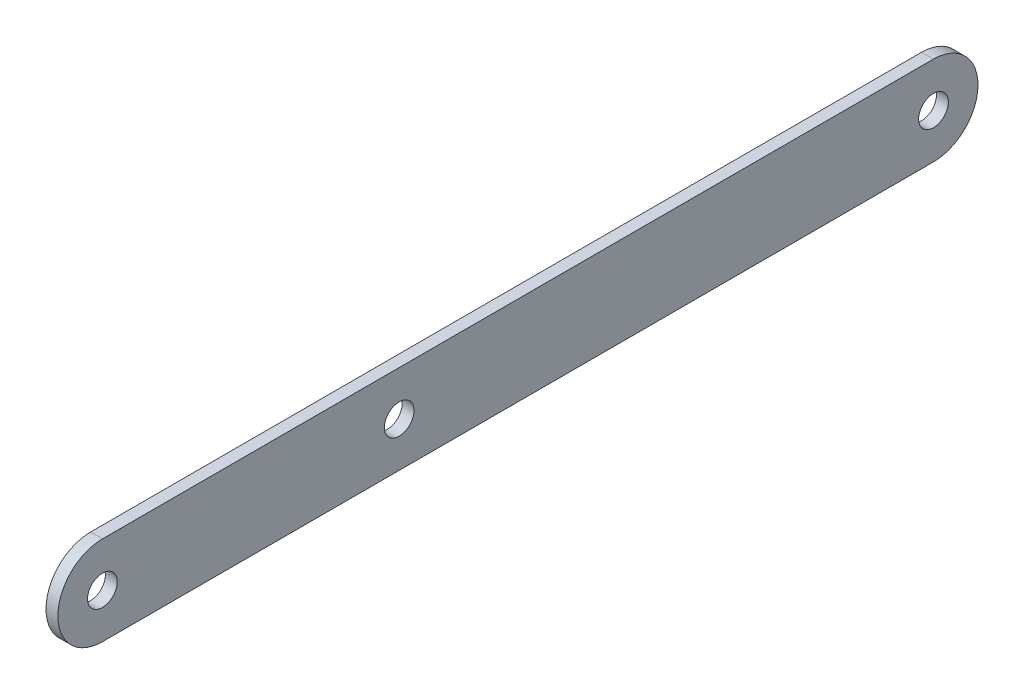
ISO-10303-21;
HEADER;
FILE_DESCRIPTION(('STEP AP214'),'2;1');
FILE_NAME('part.step','',(''),(''),'','','');
FILE_SCHEMA(('AUTOMOTIVE_DESIGN { 1 0 10303 214 1 1 1 1 }'));
ENDSEC;
DATA;
#1=APPLICATION_CONTEXT('core data for automotive mechanical design processes');
#2=APPLICATION_PROTOCOL_DEFINITION('international standard','automotive_design',2000,#1);
#3=PRODUCT_CONTEXT('',#1,'mechanical');
#4=PRODUCT('Part','Part','',(#3));
#5=PRODUCT_RELATED_PRODUCT_CATEGORY('part','',(#4));
#6=PRODUCT_DEFINITION_FORMATION('','',#4);
#7=PRODUCT_DEFINITION_CONTEXT('part definition',#1,'design');
#8=PRODUCT_DEFINITION('design','',#6,#7);
#9=PRODUCT_DEFINITION_SHAPE('','',#8);
#10=(LENGTH_UNIT() NAMED_UNIT(*) SI_UNIT(.MILLI.,.METRE.));
#11=(NAMED_UNIT(*) PLANE_ANGLE_UNIT() SI_UNIT($,.RADIAN.));
#12=(NAMED_UNIT(*) SI_UNIT($,.STERADIAN.) SOLID_ANGLE_UNIT());
#13=UNCERTAINTY_MEASURE_WITH_UNIT(LENGTH_MEASURE(1.E-05),#10,'distance_accuracy_value','');
#14=(GEOMETRIC_REPRESENTATION_CONTEXT(3) GLOBAL_UNCERTAINTY_ASSIGNED_CONTEXT((#13)) GLOBAL_UNIT_ASSIGNED_CONTEXT((#10,
#11,#12)) REPRESENTATION_CONTEXT('',''));
#15=CARTESIAN_POINT('',(0.,0.,0.));
#16=DIRECTION('',(0.,0.,1.));
#17=DIRECTION('',(1.,0.,0.));
#18=AXIS2_PLACEMENT_3D('',#15,#16,#17);
#19=CARTESIAN_POINT('',(-2.,0.,70.));
#20=DIRECTION('',(1.,0.,0.));
#21=DIRECTION('',(0.,0.,-1.));
#22=AXIS2_PLACEMENT_3D('',#19,#20,#21);
#23=CYLINDRICAL_SURFACE('',#22,7.5);
#24=CARTESIAN_POINT('',(0.,0.,70.));
#25=DIRECTION('',(1.,0.,0.));
#26=DIRECTION('',(0.,0.,-1.));
#27=AXIS2_PLACEMENT_3D('',#24,#25,#26);
#28=CIRCLE('',#27,7.5);
#29=CARTESIAN_POINT('',(0.,7.5,70.));
#30=VERTEX_POINT('',#29);
#31=CARTESIAN_POINT('',(0.,-7.5,70.));
#32=VERTEX_POINT('',#31);
#33=EDGE_CURVE('E100',#30,#32,#28,.T.);
#34=ORIENTED_EDGE('',*,*,#33,.F.);
#35=DIRECTION('',(1.,0.,0.));
#36=VECTOR('',#35,1.);
#37=CARTESIAN_POINT('',(-2.,7.5,70.));
#38=LINE('',#37,#36);
#39=CARTESIAN_POINT('',(-2.,7.5,70.));
#40=VERTEX_POINT('',#39);
#41=EDGE_CURVE('E11',#40,#30,#38,.T.);
#42=ORIENTED_EDGE('',*,*,#41,.F.);
#43=CARTESIAN_POINT('',(-2.,0.,70.));
#44=DIRECTION('',(1.,0.,0.));
#45=DIRECTION('',(0.,0.,-1.));
#46=AXIS2_PLACEMENT_3D('',#43,#44,#45);
#47=CIRCLE('',#46,7.5);
#48=CARTESIAN_POINT('',(-2.,-7.5,70.));
#49=VERTEX_POINT('',#48);
#50=EDGE_CURVE('E93',#40,#49,#47,.T.);
#51=ORIENTED_EDGE('',*,*,#50,.T.);
#52=DIRECTION('',(1.,0.,0.));
#53=VECTOR('',#52,1.);
#54=CARTESIAN_POINT('',(-2.,-7.5,70.));
#55=LINE('',#54,#53);
#56=EDGE_CURVE('E38',#49,#32,#55,.T.);
#57=ORIENTED_EDGE('',*,*,#56,.T.);
#58=EDGE_LOOP('',(#34,#42,#51,#57));
#59=FACE_BOUND('',#58,.T.);
#60=ADVANCED_FACE('F35',(#59),#23,.T.);
#61=CARTESIAN_POINT('',(-2.,7.5,-70.));
#62=DIRECTION('',(0.,1.,0.));
#63=DIRECTION('',(0.,0.,1.));
#64=AXIS2_PLACEMENT_3D('',#61,#62,#63);
#65=PLANE('',#64);
#66=DIRECTION('',(0.,0.,1.));
#67=VECTOR('',#66,1.);
#68=CARTESIAN_POINT('',(0.,7.5,-70.));
#69=LINE('',#68,#67);
#70=CARTESIAN_POINT('',(0.,7.5,-70.));
#71=VERTEX_POINT('',#70);
#72=EDGE_CURVE('E95',#71,#30,#69,.T.);
#73=ORIENTED_EDGE('',*,*,#72,.F.);
#74=DIRECTION('',(1.,0.,0.));
#75=VECTOR('',#74,1.);
#76=CARTESIAN_POINT('',(-2.,7.5,-70.));
#77=LINE('',#76,#75);
#78=CARTESIAN_POINT('',(-2.,7.5,-70.));
#79=VERTEX_POINT('',#78);
#80=EDGE_CURVE('E44',#79,#71,#77,.T.);
#81=ORIENTED_EDGE('',*,*,#80,.F.);
#82=DIRECTION('',(0.,0.,1.));
#83=VECTOR('',#82,1.);
#84=CARTESIAN_POINT('',(-2.,7.5,-70.));
#85=LINE('',#84,#83);
#86=EDGE_CURVE('E90',#79,#40,#85,.T.);
#87=ORIENTED_EDGE('',*,*,#86,.T.);
#88=ORIENTED_EDGE('',*,*,#41,.T.);
#89=EDGE_LOOP('',(#73,#81,#87,#88));
#90=FACE_BOUND('',#89,.T.);
#91=ADVANCED_FACE('F111',(#90),#65,.T.);
#92=CARTESIAN_POINT('',(-2.,0.,-70.));
#93=DIRECTION('',(1.,0.,0.));
#94=DIRECTION('',(0.,0.,-1.));
#95=AXIS2_PLACEMENT_3D('',#92,#93,#94);
#96=CYLINDRICAL_SURFACE('',#95,7.5);
#97=CARTESIAN_POINT('',(0.,0.,-70.));
#98=DIRECTION('',(1.,0.,0.));
#99=DIRECTION('',(0.,0.,1.));
#100=AXIS2_PLACEMENT_3D('',#97,#98,#99);
#101=CIRCLE('',#100,7.5);
#102=CARTESIAN_POINT('',(0.,-7.5,-70.));
#103=VERTEX_POINT('',#102);
#104=EDGE_CURVE('E85',#103,#71,#101,.T.);
#105=ORIENTED_EDGE('',*,*,#104,.F.);
#106=DIRECTION('',(1.,0.,0.));
#107=VECTOR('',#106,1.);
#108=CARTESIAN_POINT('',(-2.,-7.5,-70.));
#109=LINE('',#108,#107);
#110=CARTESIAN_POINT('',(-2.,-7.5,-70.));
#111=VERTEX_POINT('',#110);
#112=EDGE_CURVE('E80',#111,#103,#109,.T.);
#113=ORIENTED_EDGE('',*,*,#112,.F.);
#114=CARTESIAN_POINT('',(-2.,0.,-70.));
#115=DIRECTION('',(1.,0.,0.));
#116=DIRECTION('',(0.,0.,1.));
#117=AXIS2_PLACEMENT_3D('',#114,#115,#116);
#118=CIRCLE('',#117,7.5);
#119=EDGE_CURVE('E83',#111,#79,#118,.T.);
#120=ORIENTED_EDGE('',*,*,#119,.T.);
#121=ORIENTED_EDGE('',*,*,#80,.T.);
#122=EDGE_LOOP('',(#105,#113,#120,#121));
#123=FACE_BOUND('',#122,.T.);
#124=ADVANCED_FACE('F82',(#123),#96,.T.);
#125=CARTESIAN_POINT('',(-2.,-7.5,-70.));
#126=DIRECTION('',(0.,-1.,0.));
#127=DIRECTION('',(0.,0.,-1.));
#128=AXIS2_PLACEMENT_3D('',#125,#126,#127);
#129=PLANE('',#128);
#130=DIRECTION('',(0.,0.,-1.));
#131=VECTOR('',#130,1.);
#132=CARTESIAN_POINT('',(0.,-7.5,-70.));
#133=LINE('',#132,#131);
#134=EDGE_CURVE('E103',#32,#103,#133,.T.);
#135=ORIENTED_EDGE('',*,*,#134,.F.);
#136=ORIENTED_EDGE('',*,*,#56,.F.);
#137=DIRECTION('',(0.,0.,-1.));
#138=VECTOR('',#137,1.);
#139=CARTESIAN_POINT('',(-2.,-7.5,-70.));
#140=LINE('',#139,#138);
#141=EDGE_CURVE('E89',#49,#111,#140,.T.);
#142=ORIENTED_EDGE('',*,*,#141,.T.);
#143=ORIENTED_EDGE('',*,*,#112,.T.);
#144=EDGE_LOOP('',(#135,#136,#142,#143));
#145=FACE_BOUND('',#144,.T.);
#146=ADVANCED_FACE('F92',(#145),#129,.T.);
#147=CARTESIAN_POINT('',(-2.,0.,70.));
#148=DIRECTION('',(1.,0.,0.));
#149=DIRECTION('',(0.,0.,-1.));
#150=AXIS2_PLACEMENT_3D('',#147,#148,#149);
#151=PLANE('',#150);
#152=CARTESIAN_POINT('',(-2.,0.,20.));
#153=DIRECTION('',(1.,0.,0.));
#154=DIRECTION('',(0.,0.,-1.));
#155=AXIS2_PLACEMENT_3D('',#152,#153,#154);
#156=CIRCLE('',#155,2.5);
#157=CARTESIAN_POINT('',(-2.,0.,17.5));
#158=VERTEX_POINT('',#157);
#159=EDGE_CURVE('E148',#158,#158,#156,.T.);
#160=ORIENTED_EDGE('',*,*,#159,.T.);
#161=EDGE_LOOP('',(#160));
#162=FACE_BOUND('',#161,.T.);
#163=CARTESIAN_POINT('',(-2.,0.,-70.));
#164=DIRECTION('',(1.,0.,0.));
#165=DIRECTION('',(0.,0.,-1.));
#166=AXIS2_PLACEMENT_3D('',#163,#164,#165);
#167=CIRCLE('',#166,2.50000000000001);
#168=CARTESIAN_POINT('',(-2.,0.,-72.5));
#169=VERTEX_POINT('',#168);
#170=EDGE_CURVE('E156',#169,#169,#167,.T.);
#171=ORIENTED_EDGE('',*,*,#170,.T.);
#172=EDGE_LOOP('',(#171));
#173=FACE_BOUND('',#172,.T.);
#174=CARTESIAN_POINT('',(-2.,0.,70.));
#175=DIRECTION('',(1.,0.,0.));
#176=DIRECTION('',(0.,0.,-1.));
#177=AXIS2_PLACEMENT_3D('',#174,#175,#176);
#178=CIRCLE('',#177,2.50000000000001);
#179=CARTESIAN_POINT('',(-2.,0.,67.5));
#180=VERTEX_POINT('',#179);
#181=EDGE_CURVE('E104',#180,#180,#178,.T.);
#182=ORIENTED_EDGE('',*,*,#181,.T.);
#183=EDGE_LOOP('',(#182));
#184=FACE_BOUND('',#183,.T.);
#185=ORIENTED_EDGE('',*,*,#50,.F.);
#186=ORIENTED_EDGE('',*,*,#86,.F.);
#187=ORIENTED_EDGE('',*,*,#119,.F.);
#188=ORIENTED_EDGE('',*,*,#141,.F.);
#189=EDGE_LOOP('',(#185,#186,#187,#188));
#190=FACE_BOUND('',#189,.T.);
#191=ADVANCED_FACE('F88',(#162,#173,#184,#190),#151,.F.);
#192=CARTESIAN_POINT('',(0.,0.,70.));
#193=DIRECTION('',(1.,0.,0.));
#194=DIRECTION('',(0.,0.,-1.));
#195=AXIS2_PLACEMENT_3D('',#192,#193,#194);
#196=PLANE('',#195);
#197=CARTESIAN_POINT('',(0.,0.,20.));
#198=DIRECTION('',(1.,0.,0.));
#199=DIRECTION('',(0.,0.,-1.));
#200=AXIS2_PLACEMENT_3D('',#197,#198,#199);
#201=CIRCLE('',#200,2.5);
#202=CARTESIAN_POINT('',(0.,0.,17.5));
#203=VERTEX_POINT('',#202);
#204=EDGE_CURVE('E151',#203,#203,#201,.T.);
#205=ORIENTED_EDGE('',*,*,#204,.F.);
#206=EDGE_LOOP('',(#205));
#207=FACE_BOUND('',#206,.T.);
#208=CARTESIAN_POINT('',(0.,0.,-70.));
#209=DIRECTION('',(1.,0.,0.));
#210=DIRECTION('',(0.,0.,-1.));
#211=AXIS2_PLACEMENT_3D('',#208,#209,#210);
#212=CIRCLE('',#211,2.50000000000001);
#213=CARTESIAN_POINT('',(0.,0.,-72.5));
#214=VERTEX_POINT('',#213);
#215=EDGE_CURVE('E153',#214,#214,#212,.T.);
#216=ORIENTED_EDGE('',*,*,#215,.F.);
#217=EDGE_LOOP('',(#216));
#218=FACE_BOUND('',#217,.T.);
#219=CARTESIAN_POINT('',(0.,0.,70.));
#220=DIRECTION('',(1.,0.,0.));
#221=DIRECTION('',(0.,0.,-1.));
#222=AXIS2_PLACEMENT_3D('',#219,#220,#221);
#223=CIRCLE('',#222,2.50000000000001);
#224=CARTESIAN_POINT('',(0.,0.,67.5));
#225=VERTEX_POINT('',#224);
#226=EDGE_CURVE('E159',#225,#225,#223,.T.);
#227=ORIENTED_EDGE('',*,*,#226,.F.);
#228=EDGE_LOOP('',(#227));
#229=FACE_BOUND('',#228,.T.);
#230=ORIENTED_EDGE('',*,*,#33,.T.);
#231=ORIENTED_EDGE('',*,*,#134,.T.);
#232=ORIENTED_EDGE('',*,*,#104,.T.);
#233=ORIENTED_EDGE('',*,*,#72,.T.);
#234=EDGE_LOOP('',(#230,#231,#232,#233));
#235=FACE_BOUND('',#234,.T.);
#236=ADVANCED_FACE('F110',(#207,#218,#229,#235),#196,.T.);
#237=CARTESIAN_POINT('',(-2.,0.,70.));
#238=DIRECTION('',(1.,0.,0.));
#239=DIRECTION('',(0.,0.,-1.));
#240=AXIS2_PLACEMENT_3D('',#237,#238,#239);
#241=CYLINDRICAL_SURFACE('',#240,2.50000000000001);
#242=ORIENTED_EDGE('',*,*,#181,.F.);
#243=EDGE_LOOP('',(#242));
#244=FACE_BOUND('',#243,.T.);
#245=ORIENTED_EDGE('',*,*,#226,.T.);
#246=EDGE_LOOP('',(#245));
#247=FACE_BOUND('',#246,.T.);
#248=ADVANCED_FACE('F129',(#244,#247),#241,.F.);
#249=CARTESIAN_POINT('',(-2.,0.,-70.));
#250=DIRECTION('',(1.,0.,0.));
#251=DIRECTION('',(0.,0.,-1.));
#252=AXIS2_PLACEMENT_3D('',#249,#250,#251);
#253=CYLINDRICAL_SURFACE('',#252,2.50000000000001);
#254=ORIENTED_EDGE('',*,*,#170,.F.);
#255=EDGE_LOOP('',(#254));
#256=FACE_BOUND('',#255,.T.);
#257=ORIENTED_EDGE('',*,*,#215,.T.);
#258=EDGE_LOOP('',(#257));
#259=FACE_BOUND('',#258,.T.);
#260=ADVANCED_FACE('F136',(#256,#259),#253,.F.);
#261=CARTESIAN_POINT('',(-2.,0.,20.));
#262=DIRECTION('',(1.,0.,0.));
#263=DIRECTION('',(0.,0.,-1.));
#264=AXIS2_PLACEMENT_3D('',#261,#262,#263);
#265=CYLINDRICAL_SURFACE('',#264,2.5);
#266=ORIENTED_EDGE('',*,*,#159,.F.);
#267=EDGE_LOOP('',(#266));
#268=FACE_BOUND('',#267,.T.);
#269=ORIENTED_EDGE('',*,*,#204,.T.);
#270=EDGE_LOOP('',(#269));
#271=FACE_BOUND('',#270,.T.);
#272=ADVANCED_FACE('F140',(#268,#271),#265,.F.);
#273=CLOSED_SHELL('',(#60,#91,#124,#146,#191,#236,#248,#260,#272));
#274=MANIFOLD_SOLID_BREP('B2',#273);
#275=ADVANCED_BREP_SHAPE_REPRESENTATION('',(#18,#274),#14);
#276=SHAPE_DEFINITION_REPRESENTATION(#9,#275);
ENDSEC;
END-ISO-10303-21;
